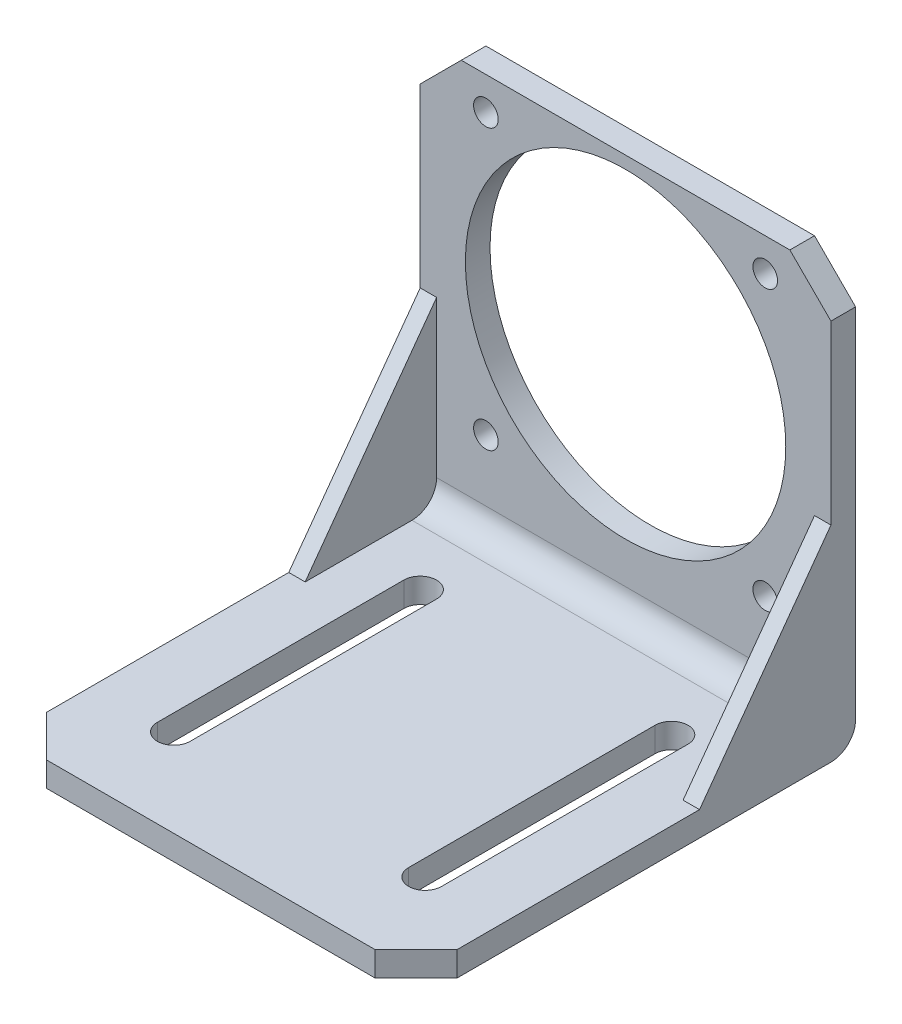
ISO-10303-21;
HEADER;
FILE_DESCRIPTION(('STEP AP214'),'2;1');
FILE_NAME('part.step','',(''),(''),'','','');
FILE_SCHEMA(('AUTOMOTIVE_DESIGN { 1 0 10303 214 1 1 1 1 }'));
ENDSEC;
DATA;
#1=APPLICATION_CONTEXT('core data for automotive mechanical design processes');
#2=APPLICATION_PROTOCOL_DEFINITION('international standard','automotive_design',2000,#1);
#3=PRODUCT_CONTEXT('',#1,'mechanical');
#4=PRODUCT('Part','Part','',(#3));
#5=PRODUCT_RELATED_PRODUCT_CATEGORY('part','',(#4));
#6=PRODUCT_DEFINITION_FORMATION('','',#4);
#7=PRODUCT_DEFINITION_CONTEXT('part definition',#1,'design');
#8=PRODUCT_DEFINITION('design','',#6,#7);
#9=PRODUCT_DEFINITION_SHAPE('','',#8);
#10=(LENGTH_UNIT() NAMED_UNIT(*) SI_UNIT(.MILLI.,.METRE.));
#11=(NAMED_UNIT(*) PLANE_ANGLE_UNIT() SI_UNIT($,.RADIAN.));
#12=(NAMED_UNIT(*) SI_UNIT($,.STERADIAN.) SOLID_ANGLE_UNIT());
#13=UNCERTAINTY_MEASURE_WITH_UNIT(LENGTH_MEASURE(1.E-05),#10,'distance_accuracy_value','');
#14=(GEOMETRIC_REPRESENTATION_CONTEXT(3) GLOBAL_UNCERTAINTY_ASSIGNED_CONTEXT((#13)) GLOBAL_UNIT_ASSIGNED_CONTEXT((#10,
#11,#12)) REPRESENTATION_CONTEXT('',''));
#15=CARTESIAN_POINT('',(0.,0.,0.));
#16=DIRECTION('',(0.,0.,1.));
#17=DIRECTION('',(1.,0.,0.));
#18=AXIS2_PLACEMENT_3D('',#15,#16,#17);
#19=CARTESIAN_POINT('',(0.,0.,3.));
#20=DIRECTION('',(0.,0.,1.));
#21=DIRECTION('',(1.,0.,0.));
#22=AXIS2_PLACEMENT_3D('',#19,#20,#21);
#23=PLANE('',#22);
#24=CARTESIAN_POINT('',(-16.9999999999992,-12.2499999999998,3.));
#25=DIRECTION('',(0.,0.,1.));
#26=DIRECTION('',(1.,0.,0.));
#27=AXIS2_PLACEMENT_3D('',#24,#25,#26);
#28=CIRCLE('',#27,1.5);
#29=CARTESIAN_POINT('',(-15.4999999999992,-12.2499999999998,3.));
#30=VERTEX_POINT('',#29);
#31=EDGE_CURVE('E330',#30,#30,#28,.T.);
#32=ORIENTED_EDGE('',*,*,#31,.F.);
#33=EDGE_LOOP('',(#32));
#34=FACE_BOUND('',#33,.T.);
#35=CARTESIAN_POINT('',(17.0000000000008,-12.2499999999992,3.));
#36=DIRECTION('',(0.,0.,1.));
#37=DIRECTION('',(1.,0.,0.));
#38=AXIS2_PLACEMENT_3D('',#35,#36,#37);
#39=CIRCLE('',#38,1.5);
#40=CARTESIAN_POINT('',(18.5000000000008,-12.2499999999992,3.));
#41=VERTEX_POINT('',#40);
#42=EDGE_CURVE('E333',#41,#41,#39,.T.);
#43=ORIENTED_EDGE('',*,*,#42,.F.);
#44=EDGE_LOOP('',(#43));
#45=FACE_BOUND('',#44,.T.);
#46=CARTESIAN_POINT('',(17.0000000000001,21.7500000000009,3.));
#47=DIRECTION('',(0.,0.,1.));
#48=DIRECTION('',(1.,0.,0.));
#49=AXIS2_PLACEMENT_3D('',#46,#47,#48);
#50=CIRCLE('',#49,1.5);
#51=CARTESIAN_POINT('',(18.5000000000001,21.7500000000009,3.));
#52=VERTEX_POINT('',#51);
#53=EDGE_CURVE('E337',#52,#52,#50,.T.);
#54=ORIENTED_EDGE('',*,*,#53,.F.);
#55=EDGE_LOOP('',(#54));
#56=FACE_BOUND('',#55,.T.);
#57=CARTESIAN_POINT('',(-17.,21.75,3.));
#58=DIRECTION('',(0.,0.,1.));
#59=DIRECTION('',(1.,0.,0.));
#60=AXIS2_PLACEMENT_3D('',#57,#58,#59);
#61=CIRCLE('',#60,1.5);
#62=CARTESIAN_POINT('',(-15.5,21.75,3.));
#63=VERTEX_POINT('',#62);
#64=EDGE_CURVE('E340',#63,#63,#61,.T.);
#65=ORIENTED_EDGE('',*,*,#64,.F.);
#66=EDGE_LOOP('',(#65));
#67=FACE_BOUND('',#66,.T.);
#68=CARTESIAN_POINT('',(0.,4.75,3.));
#69=DIRECTION('',(0.,0.,1.));
#70=DIRECTION('',(1.,0.,0.));
#71=AXIS2_PLACEMENT_3D('',#68,#69,#70);
#72=CIRCLE('',#71,19.5);
#73=CARTESIAN_POINT('',(19.5,4.75,3.));
#74=VERTEX_POINT('',#73);
#75=EDGE_CURVE('E343',#74,#74,#72,.T.);
#76=ORIENTED_EDGE('',*,*,#75,.F.);
#77=EDGE_LOOP('',(#76));
#78=FACE_BOUND('',#77,.T.);
#79=DIRECTION('',(0.,1.,0.));
#80=VECTOR('',#79,1.);
#81=CARTESIAN_POINT('',(-23.,-0.750000000000001,3.));
#82=LINE('',#81,#80);
#83=CARTESIAN_POINT('',(-23.,-19.75,3.));
#84=VERTEX_POINT('',#83);
#85=CARTESIAN_POINT('',(-23.,-0.750000000000001,3.));
#86=VERTEX_POINT('',#85);
#87=EDGE_CURVE('E228',#84,#86,#82,.T.);
#88=ORIENTED_EDGE('',*,*,#87,.F.);
#89=DIRECTION('',(-1.,0.,0.));
#90=VECTOR('',#89,1.);
#91=CARTESIAN_POINT('',(0.,-19.75,3.));
#92=LINE('',#91,#90);
#93=CARTESIAN_POINT('',(23.,-19.75,3.));
#94=VERTEX_POINT('',#93);
#95=EDGE_CURVE('E46',#84,#94,#92,.F.);
#96=ORIENTED_EDGE('',*,*,#95,.T.);
#97=DIRECTION('',(0.,1.,0.));
#98=VECTOR('',#97,1.);
#99=CARTESIAN_POINT('',(23.,-0.750000000000001,3.));
#100=LINE('',#99,#98);
#101=CARTESIAN_POINT('',(23.,-0.750000000000001,3.));
#102=VERTEX_POINT('',#101);
#103=EDGE_CURVE('E239',#94,#102,#100,.T.);
#104=ORIENTED_EDGE('',*,*,#103,.T.);
#105=DIRECTION('',(1.,0.,0.));
#106=VECTOR('',#105,1.);
#107=CARTESIAN_POINT('',(23.,-0.750000000000001,3.));
#108=LINE('',#107,#106);
#109=CARTESIAN_POINT('',(25.,-0.750000000000001,3.));
#110=VERTEX_POINT('',#109);
#111=EDGE_CURVE('E243',#102,#110,#108,.T.);
#112=ORIENTED_EDGE('',*,*,#111,.T.);
#113=DIRECTION('',(0.,-1.,0.));
#114=VECTOR('',#113,1.);
#115=CARTESIAN_POINT('',(25.,0.,3.));
#116=LINE('',#115,#114);
#117=CARTESIAN_POINT('',(25.,20.75,3.));
#118=VERTEX_POINT('',#117);
#119=EDGE_CURVE('E363',#118,#110,#116,.T.);
#120=ORIENTED_EDGE('',*,*,#119,.F.);
#121=DIRECTION('',(0.707106781186548,-0.707106781186548,0.));
#122=VECTOR('',#121,1.);
#123=CARTESIAN_POINT('',(22.875,22.875,3.));
#124=LINE('',#123,#122);
#125=CARTESIAN_POINT('',(20.,25.75,3.));
#126=VERTEX_POINT('',#125);
#127=EDGE_CURVE('E346',#126,#118,#124,.T.);
#128=ORIENTED_EDGE('',*,*,#127,.F.);
#129=DIRECTION('',(1.,0.,0.));
#130=VECTOR('',#129,1.);
#131=CARTESIAN_POINT('',(0.,25.75,3.));
#132=LINE('',#131,#130);
#133=CARTESIAN_POINT('',(-20.,25.75,3.));
#134=VERTEX_POINT('',#133);
#135=EDGE_CURVE('E349',#134,#126,#132,.T.);
#136=ORIENTED_EDGE('',*,*,#135,.F.);
#137=DIRECTION('',(-0.707106781186548,-0.707106781186548,0.));
#138=VECTOR('',#137,1.);
#139=CARTESIAN_POINT('',(-22.875,22.875,3.));
#140=LINE('',#139,#138);
#141=CARTESIAN_POINT('',(-25.,20.75,3.));
#142=VERTEX_POINT('',#141);
#143=EDGE_CURVE('E352',#134,#142,#140,.T.);
#144=ORIENTED_EDGE('',*,*,#143,.T.);
#145=DIRECTION('',(0.,-1.,0.));
#146=VECTOR('',#145,1.);
#147=CARTESIAN_POINT('',(-25.,0.,3.));
#148=LINE('',#147,#146);
#149=CARTESIAN_POINT('',(-25.,-0.750000000000001,3.));
#150=VERTEX_POINT('',#149);
#151=EDGE_CURVE('E355',#142,#150,#148,.T.);
#152=ORIENTED_EDGE('',*,*,#151,.T.);
#153=DIRECTION('',(-1.,0.,0.));
#154=VECTOR('',#153,1.);
#155=CARTESIAN_POINT('',(-23.,-0.750000000000001,3.));
#156=LINE('',#155,#154);
#157=EDGE_CURVE('E221',#86,#150,#156,.T.);
#158=ORIENTED_EDGE('',*,*,#157,.F.);
#159=EDGE_LOOP('',(#88,#96,#104,#112,#120,#128,#136,#144,#152,#158));
#160=FACE_BOUND('',#159,.T.);
#161=ADVANCED_FACE('F38',(#34,#45,#56,#67,#78,#160),#23,.T.);
#162=CARTESIAN_POINT('',(0.,-22.75,0.));
#163=DIRECTION('',(0.,-1.,0.));
#164=DIRECTION('',(0.,0.,-1.));
#165=AXIS2_PLACEMENT_3D('',#162,#163,#164);
#166=PLANE('',#165);
#167=CARTESIAN_POINT('',(-15.2,-22.75,42.8));
#168=DIRECTION('',(0.,-1.,0.));
#169=DIRECTION('',(0.,0.,-1.));
#170=AXIS2_PLACEMENT_3D('',#167,#168,#169);
#171=CIRCLE('',#170,2.00000000000001);
#172=CARTESIAN_POINT('',(-13.2,-22.75,42.8));
#173=VERTEX_POINT('',#172);
#174=CARTESIAN_POINT('',(-17.2,-22.75,42.8));
#175=VERTEX_POINT('',#174);
#176=EDGE_CURVE('E259',#173,#175,#171,.T.);
#177=ORIENTED_EDGE('',*,*,#176,.T.);
#178=DIRECTION('',(0.,0.,1.));
#179=VECTOR('',#178,1.);
#180=CARTESIAN_POINT('',(-17.2,-22.75,0.));
#181=LINE('',#180,#179);
#182=CARTESIAN_POINT('',(-17.2,-22.75,12.8));
#183=VERTEX_POINT('',#182);
#184=EDGE_CURVE('E265',#183,#175,#181,.T.);
#185=ORIENTED_EDGE('',*,*,#184,.F.);
#186=CARTESIAN_POINT('',(-15.2,-22.75,12.8));
#187=DIRECTION('',(0.,-1.,0.));
#188=DIRECTION('',(0.,0.,-1.));
#189=AXIS2_PLACEMENT_3D('',#186,#187,#188);
#190=CIRCLE('',#189,2.);
#191=CARTESIAN_POINT('',(-13.2,-22.75,12.8));
#192=VERTEX_POINT('',#191);
#193=EDGE_CURVE('E263',#183,#192,#190,.T.);
#194=ORIENTED_EDGE('',*,*,#193,.T.);
#195=DIRECTION('',(0.,0.,1.));
#196=VECTOR('',#195,1.);
#197=CARTESIAN_POINT('',(-13.2,-22.75,0.));
#198=LINE('',#197,#196);
#199=EDGE_CURVE('E261',#192,#173,#198,.T.);
#200=ORIENTED_EDGE('',*,*,#199,.T.);
#201=EDGE_LOOP('',(#177,#185,#194,#200));
#202=FACE_BOUND('',#201,.T.);
#203=CARTESIAN_POINT('',(15.4,-22.75,42.8));
#204=DIRECTION('',(0.,-1.,0.));
#205=DIRECTION('',(0.,0.,-1.));
#206=AXIS2_PLACEMENT_3D('',#203,#204,#205);
#207=CIRCLE('',#206,2.);
#208=CARTESIAN_POINT('',(17.4,-22.75,42.8));
#209=VERTEX_POINT('',#208);
#210=CARTESIAN_POINT('',(13.4,-22.75,42.8));
#211=VERTEX_POINT('',#210);
#212=EDGE_CURVE('E249',#209,#211,#207,.T.);
#213=ORIENTED_EDGE('',*,*,#212,.T.);
#214=DIRECTION('',(0.,0.,1.));
#215=VECTOR('',#214,1.);
#216=CARTESIAN_POINT('',(13.4,-22.75,0.));
#217=LINE('',#216,#215);
#218=CARTESIAN_POINT('',(13.4,-22.75,12.8));
#219=VERTEX_POINT('',#218);
#220=EDGE_CURVE('E256',#219,#211,#217,.T.);
#221=ORIENTED_EDGE('',*,*,#220,.F.);
#222=CARTESIAN_POINT('',(15.4,-22.75,12.8));
#223=DIRECTION('',(0.,-1.,0.));
#224=DIRECTION('',(0.,0.,-1.));
#225=AXIS2_PLACEMENT_3D('',#222,#223,#224);
#226=CIRCLE('',#225,2.);
#227=CARTESIAN_POINT('',(17.4,-22.75,12.8));
#228=VERTEX_POINT('',#227);
#229=EDGE_CURVE('E254',#219,#228,#226,.T.);
#230=ORIENTED_EDGE('',*,*,#229,.T.);
#231=DIRECTION('',(0.,0.,1.));
#232=VECTOR('',#231,1.);
#233=CARTESIAN_POINT('',(17.4,-22.75,0.));
#234=LINE('',#233,#232);
#235=EDGE_CURVE('E251',#228,#209,#234,.T.);
#236=ORIENTED_EDGE('',*,*,#235,.T.);
#237=EDGE_LOOP('',(#213,#221,#230,#236));
#238=FACE_BOUND('',#237,.T.);
#239=DIRECTION('',(0.,0.,-1.));
#240=VECTOR('',#239,1.);
#241=CARTESIAN_POINT('',(23.,-22.75,3.));
#242=LINE('',#241,#240);
#243=CARTESIAN_POINT('',(23.,-22.75,19.));
#244=VERTEX_POINT('',#243);
#245=CARTESIAN_POINT('',(23.,-22.75,6.));
#246=VERTEX_POINT('',#245);
#247=EDGE_CURVE('E237',#244,#246,#242,.T.);
#248=ORIENTED_EDGE('',*,*,#247,.T.);
#249=DIRECTION('',(-1.,0.,0.));
#250=VECTOR('',#249,1.);
#251=CARTESIAN_POINT('',(0.,-22.75,6.));
#252=LINE('',#251,#250);
#253=CARTESIAN_POINT('',(-23.,-22.75,6.));
#254=VERTEX_POINT('',#253);
#255=EDGE_CURVE('E383',#246,#254,#252,.T.);
#256=ORIENTED_EDGE('',*,*,#255,.T.);
#257=DIRECTION('',(0.,0.,-1.));
#258=VECTOR('',#257,1.);
#259=CARTESIAN_POINT('',(-23.,-22.75,3.));
#260=LINE('',#259,#258);
#261=CARTESIAN_POINT('',(-23.,-22.75,19.));
#262=VERTEX_POINT('',#261);
#263=EDGE_CURVE('E216',#262,#254,#260,.T.);
#264=ORIENTED_EDGE('',*,*,#263,.F.);
#265=DIRECTION('',(-1.,0.,0.));
#266=VECTOR('',#265,1.);
#267=CARTESIAN_POINT('',(-23.,-22.75,19.));
#268=LINE('',#267,#266);
#269=CARTESIAN_POINT('',(-25.,-22.75,19.));
#270=VERTEX_POINT('',#269);
#271=EDGE_CURVE('E212',#262,#270,#268,.T.);
#272=ORIENTED_EDGE('',*,*,#271,.T.);
#273=DIRECTION('',(0.,0.,1.));
#274=VECTOR('',#273,1.);
#275=CARTESIAN_POINT('',(-25.,-22.75,0.));
#276=LINE('',#275,#274);
#277=CARTESIAN_POINT('',(-25.,-22.75,48.4999999999999));
#278=VERTEX_POINT('',#277);
#279=EDGE_CURVE('E197',#270,#278,#276,.T.);
#280=ORIENTED_EDGE('',*,*,#279,.T.);
#281=DIRECTION('',(-0.707106781186544,0.,-0.707106781186551));
#282=VECTOR('',#281,1.);
#283=CARTESIAN_POINT('',(-36.7500000000001,-22.75,36.7499999999997));
#284=LINE('',#283,#282);
#285=CARTESIAN_POINT('',(-20.,-22.75,53.5));
#286=VERTEX_POINT('',#285);
#287=EDGE_CURVE('E209',#286,#278,#284,.T.);
#288=ORIENTED_EDGE('',*,*,#287,.F.);
#289=DIRECTION('',(1.,0.,0.));
#290=VECTOR('',#289,1.);
#291=CARTESIAN_POINT('',(0.,-22.75,53.5));
#292=LINE('',#291,#290);
#293=CARTESIAN_POINT('',(20.,-22.75,53.5));
#294=VERTEX_POINT('',#293);
#295=EDGE_CURVE('E268',#286,#294,#292,.T.);
#296=ORIENTED_EDGE('',*,*,#295,.T.);
#297=DIRECTION('',(-0.707106781186551,0.,0.707106781186544));
#298=VECTOR('',#297,1.);
#299=CARTESIAN_POINT('',(36.7499999999999,-22.75,36.7500000000003));
#300=LINE('',#299,#298);
#301=CARTESIAN_POINT('',(25.,-22.75,48.5000000000001));
#302=VERTEX_POINT('',#301);
#303=EDGE_CURVE('E271',#302,#294,#300,.T.);
#304=ORIENTED_EDGE('',*,*,#303,.F.);
#305=DIRECTION('',(0.,0.,1.));
#306=VECTOR('',#305,1.);
#307=CARTESIAN_POINT('',(25.,-22.75,0.));
#308=LINE('',#307,#306);
#309=CARTESIAN_POINT('',(25.,-22.75,19.));
#310=VERTEX_POINT('',#309);
#311=EDGE_CURVE('E208',#310,#302,#308,.T.);
#312=ORIENTED_EDGE('',*,*,#311,.F.);
#313=DIRECTION('',(1.,0.,0.));
#314=VECTOR('',#313,1.);
#315=CARTESIAN_POINT('',(23.,-22.75,19.));
#316=LINE('',#315,#314);
#317=EDGE_CURVE('E241',#244,#310,#316,.T.);
#318=ORIENTED_EDGE('',*,*,#317,.F.);
#319=EDGE_LOOP('',(#248,#256,#264,#272,#280,#288,#296,#304,#312,#318));
#320=FACE_BOUND('',#319,.T.);
#321=ADVANCED_FACE('F214',(#202,#238,#320),#166,.F.);
#322=CARTESIAN_POINT('',(22.875,22.875,3.));
#323=DIRECTION('',(0.707106781186547,0.707106781186547,0.));
#324=DIRECTION('',(-0.707106781186548,0.707106781186548,0.));
#325=AXIS2_PLACEMENT_3D('',#322,#323,#324);
#326=PLANE('',#325);
#327=DIRECTION('',(0.707106781186548,-0.707106781186548,0.));
#328=VECTOR('',#327,1.);
#329=CARTESIAN_POINT('',(22.875,22.875,0.));
#330=LINE('',#329,#328);
#331=CARTESIAN_POINT('',(20.,25.75,0.));
#332=VERTEX_POINT('',#331);
#333=CARTESIAN_POINT('',(25.,20.75,0.));
#334=VERTEX_POINT('',#333);
#335=EDGE_CURVE('E411',#332,#334,#330,.T.);
#336=ORIENTED_EDGE('',*,*,#335,.F.);
#337=DIRECTION('',(0.,0.,-1.));
#338=VECTOR('',#337,1.);
#339=CARTESIAN_POINT('',(20.,25.75,3.));
#340=LINE('',#339,#338);
#341=EDGE_CURVE('E364',#126,#332,#340,.T.);
#342=ORIENTED_EDGE('',*,*,#341,.F.);
#343=ORIENTED_EDGE('',*,*,#127,.T.);
#344=DIRECTION('',(0.,0.,-1.));
#345=VECTOR('',#344,1.);
#346=CARTESIAN_POINT('',(25.,20.75,3.));
#347=LINE('',#346,#345);
#348=EDGE_CURVE('E368',#118,#334,#347,.T.);
#349=ORIENTED_EDGE('',*,*,#348,.T.);
#350=EDGE_LOOP('',(#336,#342,#343,#349));
#351=FACE_BOUND('',#350,.T.);
#352=ADVANCED_FACE('F428',(#351),#326,.T.);
#353=CARTESIAN_POINT('',(0.,25.75,3.));
#354=DIRECTION('',(0.,1.,0.));
#355=DIRECTION('',(0.,0.,1.));
#356=AXIS2_PLACEMENT_3D('',#353,#354,#355);
#357=PLANE('',#356);
#358=DIRECTION('',(1.,0.,0.));
#359=VECTOR('',#358,1.);
#360=CARTESIAN_POINT('',(0.,25.75,0.));
#361=LINE('',#360,#359);
#362=CARTESIAN_POINT('',(-20.,25.75,0.));
#363=VERTEX_POINT('',#362);
#364=EDGE_CURVE('E408',#363,#332,#361,.T.);
#365=ORIENTED_EDGE('',*,*,#364,.F.);
#366=DIRECTION('',(0.,0.,-1.));
#367=VECTOR('',#366,1.);
#368=CARTESIAN_POINT('',(-20.,25.75,3.));
#369=LINE('',#368,#367);
#370=EDGE_CURVE('E399',#134,#363,#369,.T.);
#371=ORIENTED_EDGE('',*,*,#370,.F.);
#372=ORIENTED_EDGE('',*,*,#135,.T.);
#373=ORIENTED_EDGE('',*,*,#341,.T.);
#374=EDGE_LOOP('',(#365,#371,#372,#373));
#375=FACE_BOUND('',#374,.T.);
#376=ADVANCED_FACE('F424',(#375),#357,.T.);
#377=CARTESIAN_POINT('',(-22.875,22.875,3.));
#378=DIRECTION('',(0.707106781186547,-0.707106781186547,0.));
#379=DIRECTION('',(0.707106781186548,0.707106781186548,0.));
#380=AXIS2_PLACEMENT_3D('',#377,#378,#379);
#381=PLANE('',#380);
#382=DIRECTION('',(-0.707106781186548,-0.707106781186548,0.));
#383=VECTOR('',#382,1.);
#384=CARTESIAN_POINT('',(-22.875,22.875,0.));
#385=LINE('',#384,#383);
#386=CARTESIAN_POINT('',(-25.,20.75,0.));
#387=VERTEX_POINT('',#386);
#388=EDGE_CURVE('E403',#363,#387,#385,.T.);
#389=ORIENTED_EDGE('',*,*,#388,.T.);
#390=DIRECTION('',(0.,0.,-1.));
#391=VECTOR('',#390,1.);
#392=CARTESIAN_POINT('',(-25.,20.75,3.));
#393=LINE('',#392,#391);
#394=EDGE_CURVE('E394',#142,#387,#393,.T.);
#395=ORIENTED_EDGE('',*,*,#394,.F.);
#396=ORIENTED_EDGE('',*,*,#143,.F.);
#397=ORIENTED_EDGE('',*,*,#370,.T.);
#398=EDGE_LOOP('',(#389,#395,#396,#397));
#399=FACE_BOUND('',#398,.T.);
#400=ADVANCED_FACE('F404',(#399),#381,.F.);
#401=CARTESIAN_POINT('',(-25.,0.,3.));
#402=DIRECTION('',(1.,0.,0.));
#403=DIRECTION('',(0.,1.,0.));
#404=AXIS2_PLACEMENT_3D('',#401,#402,#403);
#405=PLANE('',#404);
#406=DIRECTION('',(0.,-1.,0.));
#407=VECTOR('',#406,1.);
#408=CARTESIAN_POINT('',(-25.,0.,0.));
#409=LINE('',#408,#407);
#410=CARTESIAN_POINT('',(-25.,-22.75,0.));
#411=VERTEX_POINT('',#410);
#412=EDGE_CURVE('E396',#387,#411,#409,.T.);
#413=ORIENTED_EDGE('',*,*,#412,.T.);
#414=CARTESIAN_POINT('',(-25.,-22.75,3.));
#415=DIRECTION('',(1.,0.,0.));
#416=DIRECTION('',(0.,1.,0.));
#417=AXIS2_PLACEMENT_3D('',#414,#415,#416);
#418=CIRCLE('',#417,3.);
#419=CARTESIAN_POINT('',(-25.,-25.75,3.));
#420=VERTEX_POINT('',#419);
#421=EDGE_CURVE('E381',#411,#420,#418,.F.);
#422=ORIENTED_EDGE('',*,*,#421,.T.);
#423=DIRECTION('',(0.,0.,-1.));
#424=VECTOR('',#423,1.);
#425=CARTESIAN_POINT('',(-25.,-25.75,3.));
#426=LINE('',#425,#424);
#427=CARTESIAN_POINT('',(-25.,-25.75,48.4999999999999));
#428=VERTEX_POINT('',#427);
#429=EDGE_CURVE('E400',#428,#420,#426,.T.);
#430=ORIENTED_EDGE('',*,*,#429,.F.);
#431=DIRECTION('',(0.,-1.,0.));
#432=VECTOR('',#431,1.);
#433=CARTESIAN_POINT('',(-25.,-22.75,48.4999999999999));
#434=LINE('',#433,#432);
#435=EDGE_CURVE('E204',#278,#428,#434,.T.);
#436=ORIENTED_EDGE('',*,*,#435,.F.);
#437=ORIENTED_EDGE('',*,*,#279,.F.);
#438=DIRECTION('',(0.,-0.808736084303188,0.588171697675046));
#439=VECTOR('',#438,1.);
#440=CARTESIAN_POINT('',(-25.,-22.75,19.));
#441=LINE('',#440,#439);
#442=EDGE_CURVE('E202',#150,#270,#441,.T.);
#443=ORIENTED_EDGE('',*,*,#442,.F.);
#444=ORIENTED_EDGE('',*,*,#151,.F.);
#445=ORIENTED_EDGE('',*,*,#394,.T.);
#446=EDGE_LOOP('',(#413,#422,#430,#436,#437,#443,#444,#445));
#447=FACE_BOUND('',#446,.T.);
#448=ADVANCED_FACE('F200',(#447),#405,.F.);
#449=CARTESIAN_POINT('',(0.,-25.75,3.));
#450=DIRECTION('',(0.,1.,0.));
#451=DIRECTION('',(0.,0.,1.));
#452=AXIS2_PLACEMENT_3D('',#449,#450,#451);
#453=PLANE('',#452);
#454=ORIENTED_EDGE('',*,*,#429,.T.);
#455=DIRECTION('',(1.,0.,0.));
#456=VECTOR('',#455,1.);
#457=CARTESIAN_POINT('',(0.,-25.75,3.));
#458=LINE('',#457,#456);
#459=CARTESIAN_POINT('',(25.,-25.75,3.));
#460=VERTEX_POINT('',#459);
#461=EDGE_CURVE('E374',#420,#460,#458,.T.);
#462=ORIENTED_EDGE('',*,*,#461,.T.);
#463=DIRECTION('',(0.,0.,-1.));
#464=VECTOR('',#463,1.);
#465=CARTESIAN_POINT('',(25.,-25.75,3.));
#466=LINE('',#465,#464);
#467=CARTESIAN_POINT('',(25.,-25.75,48.5000000000001));
#468=VERTEX_POINT('',#467);
#469=EDGE_CURVE('E418',#468,#460,#466,.T.);
#470=ORIENTED_EDGE('',*,*,#469,.F.);
#471=DIRECTION('',(-0.707106781186551,0.,0.707106781186544));
#472=VECTOR('',#471,1.);
#473=CARTESIAN_POINT('',(36.7499999999999,-25.75,36.7500000000003));
#474=LINE('',#473,#472);
#475=CARTESIAN_POINT('',(20.,-25.75,53.5));
#476=VERTEX_POINT('',#475);
#477=EDGE_CURVE('E252',#468,#476,#474,.T.);
#478=ORIENTED_EDGE('',*,*,#477,.T.);
#479=DIRECTION('',(1.,0.,0.));
#480=VECTOR('',#479,1.);
#481=CARTESIAN_POINT('',(0.,-25.75,53.5));
#482=LINE('',#481,#480);
#483=CARTESIAN_POINT('',(-20.,-25.75,53.5));
#484=VERTEX_POINT('',#483);
#485=EDGE_CURVE('E294',#484,#476,#482,.T.);
#486=ORIENTED_EDGE('',*,*,#485,.F.);
#487=DIRECTION('',(-0.707106781186544,0.,-0.707106781186551));
#488=VECTOR('',#487,1.);
#489=CARTESIAN_POINT('',(-36.7500000000001,-25.75,36.7499999999997));
#490=LINE('',#489,#488);
#491=EDGE_CURVE('E297',#484,#428,#490,.T.);
#492=ORIENTED_EDGE('',*,*,#491,.T.);
#493=EDGE_LOOP('',(#454,#462,#470,#478,#486,#492));
#494=FACE_BOUND('',#493,.T.);
#495=CARTESIAN_POINT('',(15.4,-25.75,42.8));
#496=DIRECTION('',(0.,-1.,0.));
#497=DIRECTION('',(0.,0.,-1.));
#498=AXIS2_PLACEMENT_3D('',#495,#496,#497);
#499=CIRCLE('',#498,2.);
#500=CARTESIAN_POINT('',(17.4,-25.75,42.8));
#501=VERTEX_POINT('',#500);
#502=CARTESIAN_POINT('',(13.4,-25.75,42.8));
#503=VERTEX_POINT('',#502);
#504=EDGE_CURVE('E246',#501,#503,#499,.T.);
#505=ORIENTED_EDGE('',*,*,#504,.F.);
#506=DIRECTION('',(0.,0.,1.));
#507=VECTOR('',#506,1.);
#508=CARTESIAN_POINT('',(17.4,-25.75,0.));
#509=LINE('',#508,#507);
#510=CARTESIAN_POINT('',(17.4,-25.75,12.8));
#511=VERTEX_POINT('',#510);
#512=EDGE_CURVE('E277',#511,#501,#509,.T.);
#513=ORIENTED_EDGE('',*,*,#512,.F.);
#514=CARTESIAN_POINT('',(15.4,-25.75,12.8));
#515=DIRECTION('',(0.,-1.,0.));
#516=DIRECTION('',(0.,0.,-1.));
#517=AXIS2_PLACEMENT_3D('',#514,#515,#516);
#518=CIRCLE('',#517,2.);
#519=CARTESIAN_POINT('',(13.4,-25.75,12.8));
#520=VERTEX_POINT('',#519);
#521=EDGE_CURVE('E279',#520,#511,#518,.T.);
#522=ORIENTED_EDGE('',*,*,#521,.F.);
#523=DIRECTION('',(0.,0.,1.));
#524=VECTOR('',#523,1.);
#525=CARTESIAN_POINT('',(13.4,-25.75,0.));
#526=LINE('',#525,#524);
#527=EDGE_CURVE('E281',#520,#503,#526,.T.);
#528=ORIENTED_EDGE('',*,*,#527,.T.);
#529=EDGE_LOOP('',(#505,#513,#522,#528));
#530=FACE_BOUND('',#529,.T.);
#531=CARTESIAN_POINT('',(-15.2,-25.75,42.8));
#532=DIRECTION('',(0.,-1.,0.));
#533=DIRECTION('',(0.,0.,-1.));
#534=AXIS2_PLACEMENT_3D('',#531,#532,#533);
#535=CIRCLE('',#534,2.00000000000001);
#536=CARTESIAN_POINT('',(-13.2,-25.75,42.8));
#537=VERTEX_POINT('',#536);
#538=CARTESIAN_POINT('',(-17.2,-25.75,42.8));
#539=VERTEX_POINT('',#538);
#540=EDGE_CURVE('E284',#537,#539,#535,.T.);
#541=ORIENTED_EDGE('',*,*,#540,.F.);
#542=DIRECTION('',(0.,0.,1.));
#543=VECTOR('',#542,1.);
#544=CARTESIAN_POINT('',(-13.2,-25.75,0.));
#545=LINE('',#544,#543);
#546=CARTESIAN_POINT('',(-13.2,-25.75,12.8));
#547=VERTEX_POINT('',#546);
#548=EDGE_CURVE('E287',#547,#537,#545,.T.);
#549=ORIENTED_EDGE('',*,*,#548,.F.);
#550=CARTESIAN_POINT('',(-15.2,-25.75,12.8));
#551=DIRECTION('',(0.,-1.,0.));
#552=DIRECTION('',(0.,0.,-1.));
#553=AXIS2_PLACEMENT_3D('',#550,#551,#552);
#554=CIRCLE('',#553,2.);
#555=CARTESIAN_POINT('',(-17.2,-25.75,12.8));
#556=VERTEX_POINT('',#555);
#557=EDGE_CURVE('E289',#556,#547,#554,.T.);
#558=ORIENTED_EDGE('',*,*,#557,.F.);
#559=DIRECTION('',(0.,0.,1.));
#560=VECTOR('',#559,1.);
#561=CARTESIAN_POINT('',(-17.2,-25.75,0.));
#562=LINE('',#561,#560);
#563=EDGE_CURVE('E291',#556,#539,#562,.T.);
#564=ORIENTED_EDGE('',*,*,#563,.T.);
#565=EDGE_LOOP('',(#541,#549,#558,#564));
#566=FACE_BOUND('',#565,.T.);
#567=ADVANCED_FACE('F538',(#494,#530,#566),#453,.F.);
#568=CARTESIAN_POINT('',(0.,4.75,3.));
#569=DIRECTION('',(0.,0.,-1.));
#570=DIRECTION('',(-1.,0.,0.));
#571=AXIS2_PLACEMENT_3D('',#568,#569,#570);
#572=CYLINDRICAL_SURFACE('',#571,19.5);
#573=ORIENTED_EDGE('',*,*,#75,.T.);
#574=EDGE_LOOP('',(#573));
#575=FACE_BOUND('',#574,.T.);
#576=CARTESIAN_POINT('',(0.,4.75,0.));
#577=DIRECTION('',(0.,0.,1.));
#578=DIRECTION('',(1.,0.,0.));
#579=AXIS2_PLACEMENT_3D('',#576,#577,#578);
#580=CIRCLE('',#579,19.5);
#581=CARTESIAN_POINT('',(19.5,4.75,0.));
#582=VERTEX_POINT('',#581);
#583=EDGE_CURVE('E430',#582,#582,#580,.T.);
#584=ORIENTED_EDGE('',*,*,#583,.F.);
#585=EDGE_LOOP('',(#584));
#586=FACE_BOUND('',#585,.T.);
#587=ADVANCED_FACE('F534',(#575,#586),#572,.F.);
#588=CARTESIAN_POINT('',(-17.,21.75,3.));
#589=DIRECTION('',(0.,0.,-1.));
#590=DIRECTION('',(-1.,0.,0.));
#591=AXIS2_PLACEMENT_3D('',#588,#589,#590);
#592=CYLINDRICAL_SURFACE('',#591,1.5);
#593=ORIENTED_EDGE('',*,*,#64,.T.);
#594=EDGE_LOOP('',(#593));
#595=FACE_BOUND('',#594,.T.);
#596=CARTESIAN_POINT('',(-17.,21.75,0.));
#597=DIRECTION('',(0.,0.,1.));
#598=DIRECTION('',(1.,0.,0.));
#599=AXIS2_PLACEMENT_3D('',#596,#597,#598);
#600=CIRCLE('',#599,1.5);
#601=CARTESIAN_POINT('',(-15.5,21.75,0.));
#602=VERTEX_POINT('',#601);
#603=EDGE_CURVE('E788',#602,#602,#600,.T.);
#604=ORIENTED_EDGE('',*,*,#603,.F.);
#605=EDGE_LOOP('',(#604));
#606=FACE_BOUND('',#605,.T.);
#607=ADVANCED_FACE('F530',(#595,#606),#592,.F.);
#608=CARTESIAN_POINT('',(17.0000000000001,21.7500000000009,3.));
#609=DIRECTION('',(0.,0.,-1.));
#610=DIRECTION('',(-1.,0.,0.));
#611=AXIS2_PLACEMENT_3D('',#608,#609,#610);
#612=CYLINDRICAL_SURFACE('',#611,1.5);
#613=ORIENTED_EDGE('',*,*,#53,.T.);
#614=EDGE_LOOP('',(#613));
#615=FACE_BOUND('',#614,.T.);
#616=CARTESIAN_POINT('',(17.0000000000001,21.7500000000009,0.));
#617=DIRECTION('',(0.,0.,1.));
#618=DIRECTION('',(1.,0.,0.));
#619=AXIS2_PLACEMENT_3D('',#616,#617,#618);
#620=CIRCLE('',#619,1.5);
#621=CARTESIAN_POINT('',(18.5000000000001,21.7500000000009,0.));
#622=VERTEX_POINT('',#621);
#623=EDGE_CURVE('E791',#622,#622,#620,.T.);
#624=ORIENTED_EDGE('',*,*,#623,.F.);
#625=EDGE_LOOP('',(#624));
#626=FACE_BOUND('',#625,.T.);
#627=ADVANCED_FACE('F526',(#615,#626),#612,.F.);
#628=CARTESIAN_POINT('',(17.0000000000008,-12.2499999999992,3.));
#629=DIRECTION('',(0.,0.,-1.));
#630=DIRECTION('',(-1.,0.,0.));
#631=AXIS2_PLACEMENT_3D('',#628,#629,#630);
#632=CYLINDRICAL_SURFACE('',#631,1.5);
#633=ORIENTED_EDGE('',*,*,#42,.T.);
#634=EDGE_LOOP('',(#633));
#635=FACE_BOUND('',#634,.T.);
#636=CARTESIAN_POINT('',(17.0000000000008,-12.2499999999992,0.));
#637=DIRECTION('',(0.,0.,1.));
#638=DIRECTION('',(1.,0.,0.));
#639=AXIS2_PLACEMENT_3D('',#636,#637,#638);
#640=CIRCLE('',#639,1.5);
#641=CARTESIAN_POINT('',(18.5000000000008,-12.2499999999992,0.));
#642=VERTEX_POINT('',#641);
#643=EDGE_CURVE('E796',#642,#642,#640,.T.);
#644=ORIENTED_EDGE('',*,*,#643,.F.);
#645=EDGE_LOOP('',(#644));
#646=FACE_BOUND('',#645,.T.);
#647=ADVANCED_FACE('F522',(#635,#646),#632,.F.);
#648=CARTESIAN_POINT('',(-16.9999999999992,-12.2499999999998,3.));
#649=DIRECTION('',(0.,0.,-1.));
#650=DIRECTION('',(-1.,0.,0.));
#651=AXIS2_PLACEMENT_3D('',#648,#649,#650);
#652=CYLINDRICAL_SURFACE('',#651,1.5);
#653=ORIENTED_EDGE('',*,*,#31,.T.);
#654=EDGE_LOOP('',(#653));
#655=FACE_BOUND('',#654,.T.);
#656=CARTESIAN_POINT('',(-16.9999999999992,-12.2499999999998,0.));
#657=DIRECTION('',(0.,0.,1.));
#658=DIRECTION('',(1.,0.,0.));
#659=AXIS2_PLACEMENT_3D('',#656,#657,#658);
#660=CIRCLE('',#659,1.5);
#661=CARTESIAN_POINT('',(-15.4999999999992,-12.2499999999998,0.));
#662=VERTEX_POINT('',#661);
#663=EDGE_CURVE('E304',#662,#662,#660,.T.);
#664=ORIENTED_EDGE('',*,*,#663,.F.);
#665=EDGE_LOOP('',(#664));
#666=FACE_BOUND('',#665,.T.);
#667=ADVANCED_FACE('F445',(#655,#666),#652,.F.);
#668=CARTESIAN_POINT('',(25.,0.,3.));
#669=DIRECTION('',(1.,0.,0.));
#670=DIRECTION('',(0.,1.,0.));
#671=AXIS2_PLACEMENT_3D('',#668,#669,#670);
#672=PLANE('',#671);
#673=ORIENTED_EDGE('',*,*,#469,.T.);
#674=CARTESIAN_POINT('',(25.,-22.75,3.));
#675=DIRECTION('',(1.,0.,0.));
#676=DIRECTION('',(0.,1.,0.));
#677=AXIS2_PLACEMENT_3D('',#674,#675,#676);
#678=CIRCLE('',#677,3.);
#679=CARTESIAN_POINT('',(25.,-22.75,0.));
#680=VERTEX_POINT('',#679);
#681=EDGE_CURVE('E377',#460,#680,#678,.T.);
#682=ORIENTED_EDGE('',*,*,#681,.T.);
#683=DIRECTION('',(0.,-1.,0.));
#684=VECTOR('',#683,1.);
#685=CARTESIAN_POINT('',(25.,0.,0.));
#686=LINE('',#685,#684);
#687=EDGE_CURVE('E334',#334,#680,#686,.T.);
#688=ORIENTED_EDGE('',*,*,#687,.F.);
#689=ORIENTED_EDGE('',*,*,#348,.F.);
#690=ORIENTED_EDGE('',*,*,#119,.T.);
#691=DIRECTION('',(0.,-0.808736084303188,0.588171697675046));
#692=VECTOR('',#691,1.);
#693=CARTESIAN_POINT('',(25.,-22.75,19.));
#694=LINE('',#693,#692);
#695=EDGE_CURVE('E220',#110,#310,#694,.T.);
#696=ORIENTED_EDGE('',*,*,#695,.T.);
#697=ORIENTED_EDGE('',*,*,#311,.T.);
#698=DIRECTION('',(0.,-1.,0.));
#699=VECTOR('',#698,1.);
#700=CARTESIAN_POINT('',(25.,-22.75,48.5000000000001));
#701=LINE('',#700,#699);
#702=EDGE_CURVE('E305',#302,#468,#701,.T.);
#703=ORIENTED_EDGE('',*,*,#702,.T.);
#704=EDGE_LOOP('',(#673,#682,#688,#689,#690,#696,#697,#703));
#705=FACE_BOUND('',#704,.T.);
#706=ADVANCED_FACE('F435',(#705),#672,.T.);
#707=CARTESIAN_POINT('',(0.,0.,0.));
#708=DIRECTION('',(0.,0.,1.));
#709=DIRECTION('',(1.,0.,0.));
#710=AXIS2_PLACEMENT_3D('',#707,#708,#709);
#711=PLANE('',#710);
#712=ORIENTED_EDGE('',*,*,#663,.T.);
#713=EDGE_LOOP('',(#712));
#714=FACE_BOUND('',#713,.T.);
#715=ORIENTED_EDGE('',*,*,#643,.T.);
#716=EDGE_LOOP('',(#715));
#717=FACE_BOUND('',#716,.T.);
#718=ORIENTED_EDGE('',*,*,#623,.T.);
#719=EDGE_LOOP('',(#718));
#720=FACE_BOUND('',#719,.T.);
#721=ORIENTED_EDGE('',*,*,#603,.T.);
#722=EDGE_LOOP('',(#721));
#723=FACE_BOUND('',#722,.T.);
#724=ORIENTED_EDGE('',*,*,#583,.T.);
#725=EDGE_LOOP('',(#724));
#726=FACE_BOUND('',#725,.T.);
#727=ORIENTED_EDGE('',*,*,#687,.T.);
#728=DIRECTION('',(1.,0.,0.));
#729=VECTOR('',#728,1.);
#730=CARTESIAN_POINT('',(0.,-22.75,0.));
#731=LINE('',#730,#729);
#732=EDGE_CURVE('E379',#680,#411,#731,.F.);
#733=ORIENTED_EDGE('',*,*,#732,.T.);
#734=ORIENTED_EDGE('',*,*,#412,.F.);
#735=ORIENTED_EDGE('',*,*,#388,.F.);
#736=ORIENTED_EDGE('',*,*,#364,.T.);
#737=ORIENTED_EDGE('',*,*,#335,.T.);
#738=EDGE_LOOP('',(#727,#733,#734,#735,#736,#737));
#739=FACE_BOUND('',#738,.T.);
#740=ADVANCED_FACE('F431',(#714,#717,#720,#723,#726,#739),#711,.F.);
#741=CARTESIAN_POINT('',(0.,-22.75,53.5));
#742=DIRECTION('',(0.,0.,-1.));
#743=DIRECTION('',(-1.,0.,0.));
#744=AXIS2_PLACEMENT_3D('',#741,#742,#743);
#745=PLANE('',#744);
#746=ORIENTED_EDGE('',*,*,#485,.T.);
#747=DIRECTION('',(0.,-1.,0.));
#748=VECTOR('',#747,1.);
#749=CARTESIAN_POINT('',(20.,-22.75,53.5));
#750=LINE('',#749,#748);
#751=EDGE_CURVE('E302',#294,#476,#750,.T.);
#752=ORIENTED_EDGE('',*,*,#751,.F.);
#753=ORIENTED_EDGE('',*,*,#295,.F.);
#754=DIRECTION('',(0.,-1.,0.));
#755=VECTOR('',#754,1.);
#756=CARTESIAN_POINT('',(-20.,-22.75,53.5));
#757=LINE('',#756,#755);
#758=EDGE_CURVE('E309',#286,#484,#757,.T.);
#759=ORIENTED_EDGE('',*,*,#758,.T.);
#760=EDGE_LOOP('',(#746,#752,#753,#759));
#761=FACE_BOUND('',#760,.T.);
#762=ADVANCED_FACE('F434',(#761),#745,.F.);
#763=CARTESIAN_POINT('',(36.7499999999999,-22.75,36.7500000000003));
#764=DIRECTION('',(0.707106781186544,0.,0.707106781186551));
#765=DIRECTION('',(0.707106781186551,0.,-0.707106781186544));
#766=AXIS2_PLACEMENT_3D('',#763,#764,#765);
#767=PLANE('',#766);
#768=ORIENTED_EDGE('',*,*,#477,.F.);
#769=ORIENTED_EDGE('',*,*,#702,.F.);
#770=ORIENTED_EDGE('',*,*,#303,.T.);
#771=ORIENTED_EDGE('',*,*,#751,.T.);
#772=EDGE_LOOP('',(#768,#769,#770,#771));
#773=FACE_BOUND('',#772,.T.);
#774=ADVANCED_FACE('F442',(#773),#767,.T.);
#775=CARTESIAN_POINT('',(-15.2,-22.75,42.8));
#776=DIRECTION('',(0.,-1.,0.));
#777=DIRECTION('',(0.,0.,-1.));
#778=AXIS2_PLACEMENT_3D('',#775,#776,#777);
#779=CYLINDRICAL_SURFACE('',#778,2.00000000000001);
#780=ORIENTED_EDGE('',*,*,#540,.T.);
#781=DIRECTION('',(0.,-1.,0.));
#782=VECTOR('',#781,1.);
#783=CARTESIAN_POINT('',(-17.2,-22.75,42.8));
#784=LINE('',#783,#782);
#785=EDGE_CURVE('E311',#175,#539,#784,.T.);
#786=ORIENTED_EDGE('',*,*,#785,.F.);
#787=ORIENTED_EDGE('',*,*,#176,.F.);
#788=DIRECTION('',(0.,-1.,0.));
#789=VECTOR('',#788,1.);
#790=CARTESIAN_POINT('',(-13.2,-22.75,42.8));
#791=LINE('',#790,#789);
#792=EDGE_CURVE('E318',#173,#537,#791,.T.);
#793=ORIENTED_EDGE('',*,*,#792,.T.);
#794=EDGE_LOOP('',(#780,#786,#787,#793));
#795=FACE_BOUND('',#794,.T.);
#796=ADVANCED_FACE('F480',(#795),#779,.F.);
#797=CARTESIAN_POINT('',(-17.2,-22.75,0.));
#798=DIRECTION('',(1.,0.,0.));
#799=DIRECTION('',(0.,0.,-1.));
#800=AXIS2_PLACEMENT_3D('',#797,#798,#799);
#801=PLANE('',#800);
#802=ORIENTED_EDGE('',*,*,#563,.F.);
#803=DIRECTION('',(0.,-1.,0.));
#804=VECTOR('',#803,1.);
#805=CARTESIAN_POINT('',(-17.2,-22.75,12.8));
#806=LINE('',#805,#804);
#807=EDGE_CURVE('E313',#183,#556,#806,.T.);
#808=ORIENTED_EDGE('',*,*,#807,.F.);
#809=ORIENTED_EDGE('',*,*,#184,.T.);
#810=ORIENTED_EDGE('',*,*,#785,.T.);
#811=EDGE_LOOP('',(#802,#808,#809,#810));
#812=FACE_BOUND('',#811,.T.);
#813=ADVANCED_FACE('F483',(#812),#801,.T.);
#814=CARTESIAN_POINT('',(-15.2,-22.75,12.8));
#815=DIRECTION('',(0.,-1.,0.));
#816=DIRECTION('',(0.,0.,-1.));
#817=AXIS2_PLACEMENT_3D('',#814,#815,#816);
#818=CYLINDRICAL_SURFACE('',#817,2.);
#819=ORIENTED_EDGE('',*,*,#557,.T.);
#820=DIRECTION('',(0.,-1.,0.));
#821=VECTOR('',#820,1.);
#822=CARTESIAN_POINT('',(-13.2,-22.75,12.8));
#823=LINE('',#822,#821);
#824=EDGE_CURVE('E315',#192,#547,#823,.T.);
#825=ORIENTED_EDGE('',*,*,#824,.F.);
#826=ORIENTED_EDGE('',*,*,#193,.F.);
#827=ORIENTED_EDGE('',*,*,#807,.T.);
#828=EDGE_LOOP('',(#819,#825,#826,#827));
#829=FACE_BOUND('',#828,.T.);
#830=ADVANCED_FACE('F465',(#829),#818,.F.);
#831=CARTESIAN_POINT('',(15.4,-22.75,42.8));
#832=DIRECTION('',(0.,-1.,0.));
#833=DIRECTION('',(0.,0.,-1.));
#834=AXIS2_PLACEMENT_3D('',#831,#832,#833);
#835=CYLINDRICAL_SURFACE('',#834,2.);
#836=ORIENTED_EDGE('',*,*,#504,.T.);
#837=DIRECTION('',(0.,-1.,0.));
#838=VECTOR('',#837,1.);
#839=CARTESIAN_POINT('',(13.4,-22.75,42.8));
#840=LINE('',#839,#838);
#841=EDGE_CURVE('E321',#211,#503,#840,.T.);
#842=ORIENTED_EDGE('',*,*,#841,.F.);
#843=ORIENTED_EDGE('',*,*,#212,.F.);
#844=DIRECTION('',(0.,-1.,0.));
#845=VECTOR('',#844,1.);
#846=CARTESIAN_POINT('',(17.4,-22.75,42.8));
#847=LINE('',#846,#845);
#848=EDGE_CURVE('E274',#209,#501,#847,.T.);
#849=ORIENTED_EDGE('',*,*,#848,.T.);
#850=EDGE_LOOP('',(#836,#842,#843,#849));
#851=FACE_BOUND('',#850,.T.);
#852=ADVANCED_FACE('F461',(#851),#835,.F.);
#853=CARTESIAN_POINT('',(13.4,-22.75,0.));
#854=DIRECTION('',(1.,0.,0.));
#855=DIRECTION('',(0.,0.,-1.));
#856=AXIS2_PLACEMENT_3D('',#853,#854,#855);
#857=PLANE('',#856);
#858=ORIENTED_EDGE('',*,*,#527,.F.);
#859=DIRECTION('',(0.,-1.,0.));
#860=VECTOR('',#859,1.);
#861=CARTESIAN_POINT('',(13.4,-22.75,12.8));
#862=LINE('',#861,#860);
#863=EDGE_CURVE('E323',#219,#520,#862,.T.);
#864=ORIENTED_EDGE('',*,*,#863,.F.);
#865=ORIENTED_EDGE('',*,*,#220,.T.);
#866=ORIENTED_EDGE('',*,*,#841,.T.);
#867=EDGE_LOOP('',(#858,#864,#865,#866));
#868=FACE_BOUND('',#867,.T.);
#869=ADVANCED_FACE('F464',(#868),#857,.T.);
#870=CARTESIAN_POINT('',(15.4,-22.75,12.8));
#871=DIRECTION('',(0.,-1.,0.));
#872=DIRECTION('',(0.,0.,-1.));
#873=AXIS2_PLACEMENT_3D('',#870,#871,#872);
#874=CYLINDRICAL_SURFACE('',#873,2.);
#875=ORIENTED_EDGE('',*,*,#521,.T.);
#876=DIRECTION('',(0.,-1.,0.));
#877=VECTOR('',#876,1.);
#878=CARTESIAN_POINT('',(17.4,-22.75,12.8));
#879=LINE('',#878,#877);
#880=EDGE_CURVE('E325',#228,#511,#879,.T.);
#881=ORIENTED_EDGE('',*,*,#880,.F.);
#882=ORIENTED_EDGE('',*,*,#229,.F.);
#883=ORIENTED_EDGE('',*,*,#863,.T.);
#884=EDGE_LOOP('',(#875,#881,#882,#883));
#885=FACE_BOUND('',#884,.T.);
#886=ADVANCED_FACE('F473',(#885),#874,.F.);
#887=CARTESIAN_POINT('',(-13.2,-22.75,0.));
#888=DIRECTION('',(1.,0.,0.));
#889=DIRECTION('',(0.,0.,-1.));
#890=AXIS2_PLACEMENT_3D('',#887,#888,#889);
#891=PLANE('',#890);
#892=ORIENTED_EDGE('',*,*,#548,.T.);
#893=ORIENTED_EDGE('',*,*,#792,.F.);
#894=ORIENTED_EDGE('',*,*,#199,.F.);
#895=ORIENTED_EDGE('',*,*,#824,.T.);
#896=EDGE_LOOP('',(#892,#893,#894,#895));
#897=FACE_BOUND('',#896,.T.);
#898=ADVANCED_FACE('F471',(#897),#891,.F.);
#899=CARTESIAN_POINT('',(17.4,-22.75,0.));
#900=DIRECTION('',(1.,0.,0.));
#901=DIRECTION('',(0.,0.,-1.));
#902=AXIS2_PLACEMENT_3D('',#899,#900,#901);
#903=PLANE('',#902);
#904=ORIENTED_EDGE('',*,*,#512,.T.);
#905=ORIENTED_EDGE('',*,*,#848,.F.);
#906=ORIENTED_EDGE('',*,*,#235,.F.);
#907=ORIENTED_EDGE('',*,*,#880,.T.);
#908=EDGE_LOOP('',(#904,#905,#906,#907));
#909=FACE_BOUND('',#908,.T.);
#910=ADVANCED_FACE('F467',(#909),#903,.F.);
#911=CARTESIAN_POINT('',(-36.7500000000001,-22.75,36.7499999999997));
#912=DIRECTION('',(-0.707106781186551,0.,0.707106781186544));
#913=DIRECTION('',(0.707106781186544,0.,0.707106781186551));
#914=AXIS2_PLACEMENT_3D('',#911,#912,#913);
#915=PLANE('',#914);
#916=ORIENTED_EDGE('',*,*,#491,.F.);
#917=ORIENTED_EDGE('',*,*,#758,.F.);
#918=ORIENTED_EDGE('',*,*,#287,.T.);
#919=ORIENTED_EDGE('',*,*,#435,.T.);
#920=EDGE_LOOP('',(#916,#917,#918,#919));
#921=FACE_BOUND('',#920,.T.);
#922=ADVANCED_FACE('F470',(#921),#915,.T.);
#923=CARTESIAN_POINT('',(23.,-22.75,19.));
#924=DIRECTION('',(0.,0.588171697675046,0.808736084303189));
#925=DIRECTION('',(0.,-0.808736084303188,0.588171697675046));
#926=AXIS2_PLACEMENT_3D('',#923,#924,#925);
#927=PLANE('',#926);
#928=ORIENTED_EDGE('',*,*,#695,.F.);
#929=ORIENTED_EDGE('',*,*,#111,.F.);
#930=DIRECTION('',(0.,-0.808736084303188,0.588171697675046));
#931=VECTOR('',#930,1.);
#932=CARTESIAN_POINT('',(23.,-22.75,19.));
#933=LINE('',#932,#931);
#934=EDGE_CURVE('E234',#102,#244,#933,.T.);
#935=ORIENTED_EDGE('',*,*,#934,.T.);
#936=ORIENTED_EDGE('',*,*,#317,.T.);
#937=EDGE_LOOP('',(#928,#929,#935,#936));
#938=FACE_BOUND('',#937,.T.);
#939=ADVANCED_FACE('F496',(#938),#927,.T.);
#940=CARTESIAN_POINT('',(23.,0.,0.));
#941=DIRECTION('',(1.,0.,0.));
#942=DIRECTION('',(0.,1.,0.));
#943=AXIS2_PLACEMENT_3D('',#940,#941,#942);
#944=PLANE('',#943);
#945=ORIENTED_EDGE('',*,*,#103,.F.);
#946=CARTESIAN_POINT('',(23.,-19.75,6.));
#947=DIRECTION('',(1.,0.,0.));
#948=DIRECTION('',(0.,1.,0.));
#949=AXIS2_PLACEMENT_3D('',#946,#947,#948);
#950=CIRCLE('',#949,3.);
#951=EDGE_CURVE('E11',#94,#246,#950,.F.);
#952=ORIENTED_EDGE('',*,*,#951,.T.);
#953=ORIENTED_EDGE('',*,*,#247,.F.);
#954=ORIENTED_EDGE('',*,*,#934,.F.);
#955=EDGE_LOOP('',(#945,#952,#953,#954));
#956=FACE_BOUND('',#955,.T.);
#957=ADVANCED_FACE('F503',(#956),#944,.F.);
#958=CARTESIAN_POINT('',(-23.,-22.75,19.));
#959=DIRECTION('',(0.,-0.588171697675046,-0.808736084303189));
#960=DIRECTION('',(0.,0.808736084303188,-0.588171697675046));
#961=AXIS2_PLACEMENT_3D('',#958,#959,#960);
#962=PLANE('',#961);
#963=ORIENTED_EDGE('',*,*,#442,.T.);
#964=ORIENTED_EDGE('',*,*,#271,.F.);
#965=DIRECTION('',(0.,-0.808736084303188,0.588171697675046));
#966=VECTOR('',#965,1.);
#967=CARTESIAN_POINT('',(-23.,-22.75,19.));
#968=LINE('',#967,#966);
#969=EDGE_CURVE('E226',#86,#262,#968,.T.);
#970=ORIENTED_EDGE('',*,*,#969,.F.);
#971=ORIENTED_EDGE('',*,*,#157,.T.);
#972=EDGE_LOOP('',(#963,#964,#970,#971));
#973=FACE_BOUND('',#972,.T.);
#974=ADVANCED_FACE('F224',(#973),#962,.F.);
#975=CARTESIAN_POINT('',(-23.,0.,0.));
#976=DIRECTION('',(-1.,0.,0.));
#977=DIRECTION('',(0.,1.,0.));
#978=AXIS2_PLACEMENT_3D('',#975,#976,#977);
#979=PLANE('',#978);
#980=ORIENTED_EDGE('',*,*,#263,.T.);
#981=CARTESIAN_POINT('',(-23.,-19.75,6.));
#982=DIRECTION('',(-1.,0.,0.));
#983=DIRECTION('',(0.,-1.,0.));
#984=AXIS2_PLACEMENT_3D('',#981,#982,#983);
#985=CIRCLE('',#984,3.);
#986=EDGE_CURVE('E60',#254,#84,#985,.F.);
#987=ORIENTED_EDGE('',*,*,#986,.T.);
#988=ORIENTED_EDGE('',*,*,#87,.T.);
#989=ORIENTED_EDGE('',*,*,#969,.T.);
#990=EDGE_LOOP('',(#980,#987,#988,#989));
#991=FACE_BOUND('',#990,.T.);
#992=ADVANCED_FACE('F389',(#991),#979,.F.);
#993=CARTESIAN_POINT('',(0.,-22.75,3.));
#994=DIRECTION('',(1.,0.,0.));
#995=DIRECTION('',(0.,0.,-1.));
#996=AXIS2_PLACEMENT_3D('',#993,#994,#995);
#997=CYLINDRICAL_SURFACE('',#996,3.);
#998=ORIENTED_EDGE('',*,*,#421,.F.);
#999=ORIENTED_EDGE('',*,*,#732,.F.);
#1000=ORIENTED_EDGE('',*,*,#681,.F.);
#1001=ORIENTED_EDGE('',*,*,#461,.F.);
#1002=EDGE_LOOP('',(#998,#999,#1000,#1001));
#1003=FACE_BOUND('',#1002,.T.);
#1004=ADVANCED_FACE('F511',(#1003),#997,.T.);
#1005=CARTESIAN_POINT('',(0.,-19.75,6.));
#1006=DIRECTION('',(-1.,0.,0.));
#1007=DIRECTION('',(0.,0.,1.));
#1008=AXIS2_PLACEMENT_3D('',#1005,#1006,#1007);
#1009=CYLINDRICAL_SURFACE('',#1008,3.);
#1010=ORIENTED_EDGE('',*,*,#951,.F.);
#1011=ORIENTED_EDGE('',*,*,#95,.F.);
#1012=ORIENTED_EDGE('',*,*,#986,.F.);
#1013=ORIENTED_EDGE('',*,*,#255,.F.);
#1014=EDGE_LOOP('',(#1010,#1011,#1012,#1013));
#1015=FACE_BOUND('',#1014,.T.);
#1016=ADVANCED_FACE('F40',(#1015),#1009,.F.);
#1017=CLOSED_SHELL('',(#161,#321,#352,#376,#400,#448,#567,#587,#607,#627,#647,#667,#706,#740,
#762,#774,#796,#813,#830,#852,#869,#886,#898,#910,#922,#939,#957,#974,#992,#1004,#1016));
#1018=MANIFOLD_SOLID_BREP('B2',#1017);
#1019=ADVANCED_BREP_SHAPE_REPRESENTATION('',(#18,#1018),#14);
#1020=SHAPE_DEFINITION_REPRESENTATION(#9,#1019);
ENDSEC;
END-ISO-10303-21;
